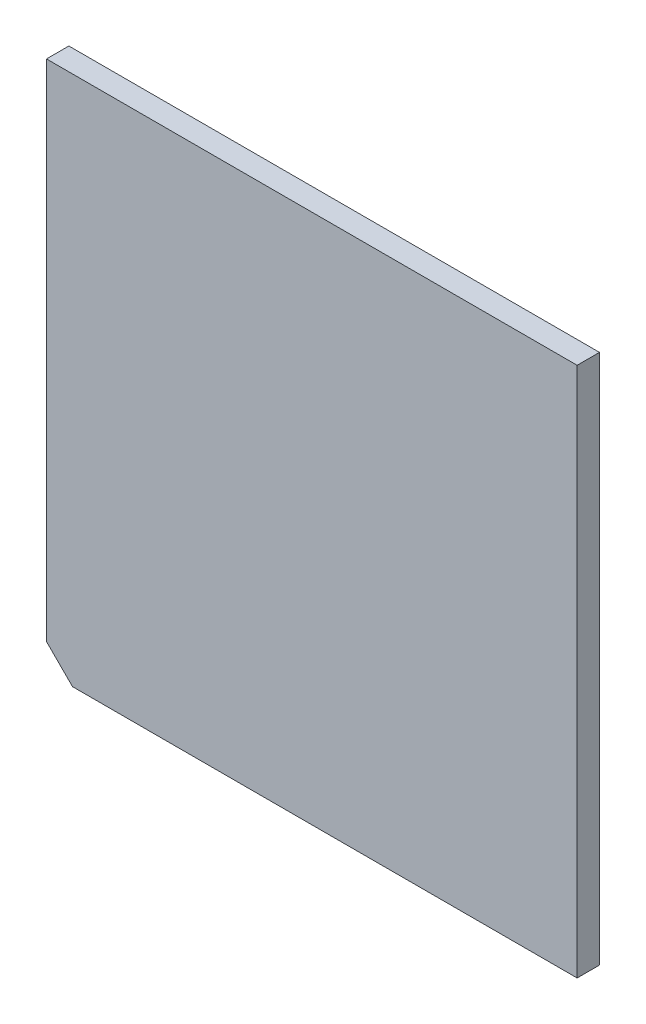
ISO-10303-21;
HEADER;
FILE_DESCRIPTION(('STEP AP214'),'2;1');
FILE_NAME('part.step','',(''),(''),'','','');
FILE_SCHEMA(('AUTOMOTIVE_DESIGN { 1 0 10303 214 1 1 1 1 }'));
ENDSEC;
DATA;
#1=APPLICATION_CONTEXT('core data for automotive mechanical design processes');
#2=APPLICATION_PROTOCOL_DEFINITION('international standard','automotive_design',2000,#1);
#3=PRODUCT_CONTEXT('',#1,'mechanical');
#4=PRODUCT('Part','Part','',(#3));
#5=PRODUCT_RELATED_PRODUCT_CATEGORY('part','',(#4));
#6=PRODUCT_DEFINITION_FORMATION('','',#4);
#7=PRODUCT_DEFINITION_CONTEXT('part definition',#1,'design');
#8=PRODUCT_DEFINITION('design','',#6,#7);
#9=PRODUCT_DEFINITION_SHAPE('','',#8);
#10=(LENGTH_UNIT() NAMED_UNIT(*) SI_UNIT(.MILLI.,.METRE.));
#11=(NAMED_UNIT(*) PLANE_ANGLE_UNIT() SI_UNIT($,.RADIAN.));
#12=(NAMED_UNIT(*) SI_UNIT($,.STERADIAN.) SOLID_ANGLE_UNIT());
#13=UNCERTAINTY_MEASURE_WITH_UNIT(LENGTH_MEASURE(1.E-05),#10,'distance_accuracy_value','');
#14=(GEOMETRIC_REPRESENTATION_CONTEXT(3) GLOBAL_UNCERTAINTY_ASSIGNED_CONTEXT((#13)) GLOBAL_UNIT_ASSIGNED_CONTEXT((#10,
#11,#12)) REPRESENTATION_CONTEXT('',''));
#15=CARTESIAN_POINT('',(0.,0.,0.));
#16=DIRECTION('',(0.,0.,1.));
#17=DIRECTION('',(1.,0.,0.));
#18=AXIS2_PLACEMENT_3D('',#15,#16,#17);
#19=CARTESIAN_POINT('',(51.,51.,4.3));
#20=DIRECTION('',(-1.,0.,0.));
#21=DIRECTION('',(0.,-1.,0.));
#22=AXIS2_PLACEMENT_3D('',#19,#20,#21);
#23=PLANE('',#22);
#24=DIRECTION('',(0.,1.,0.));
#25=VECTOR('',#24,1.);
#26=CARTESIAN_POINT('',(51.,51.,0.));
#27=LINE('',#26,#25);
#28=CARTESIAN_POINT('',(51.,-51.,0.));
#29=VERTEX_POINT('',#28);
#30=CARTESIAN_POINT('',(51.,51.,0.));
#31=VERTEX_POINT('',#30);
#32=EDGE_CURVE('E115',#29,#31,#27,.T.);
#33=ORIENTED_EDGE('',*,*,#32,.T.);
#34=DIRECTION('',(0.,0.,-1.));
#35=VECTOR('',#34,1.);
#36=CARTESIAN_POINT('',(51.,51.,4.3));
#37=LINE('',#36,#35);
#38=CARTESIAN_POINT('',(51.,51.,4.3));
#39=VERTEX_POINT('',#38);
#40=EDGE_CURVE('E95',#39,#31,#37,.T.);
#41=ORIENTED_EDGE('',*,*,#40,.F.);
#42=DIRECTION('',(0.,1.,0.));
#43=VECTOR('',#42,1.);
#44=CARTESIAN_POINT('',(51.,51.,4.3));
#45=LINE('',#44,#43);
#46=CARTESIAN_POINT('',(51.,-51.,4.3));
#47=VERTEX_POINT('',#46);
#48=EDGE_CURVE('E102',#47,#39,#45,.T.);
#49=ORIENTED_EDGE('',*,*,#48,.F.);
#50=DIRECTION('',(0.,0.,-1.));
#51=VECTOR('',#50,1.);
#52=CARTESIAN_POINT('',(51.,-51.,4.3));
#53=LINE('',#52,#51);
#54=EDGE_CURVE('E123',#47,#29,#53,.T.);
#55=ORIENTED_EDGE('',*,*,#54,.T.);
#56=EDGE_LOOP('',(#33,#41,#49,#55));
#57=FACE_BOUND('',#56,.T.);
#58=ADVANCED_FACE('F42',(#57),#23,.F.);
#59=CARTESIAN_POINT('',(-51.,51.,4.3));
#60=DIRECTION('',(0.,-1.,0.));
#61=DIRECTION('',(0.,0.,-1.));
#62=AXIS2_PLACEMENT_3D('',#59,#60,#61);
#63=PLANE('',#62);
#64=DIRECTION('',(-1.,0.,0.));
#65=VECTOR('',#64,1.);
#66=CARTESIAN_POINT('',(-51.,51.,0.));
#67=LINE('',#66,#65);
#68=CARTESIAN_POINT('',(-51.,51.,0.));
#69=VERTEX_POINT('',#68);
#70=EDGE_CURVE('E136',#31,#69,#67,.T.);
#71=ORIENTED_EDGE('',*,*,#70,.T.);
#72=DIRECTION('',(0.,0.,-1.));
#73=VECTOR('',#72,1.);
#74=CARTESIAN_POINT('',(-51.,51.,4.3));
#75=LINE('',#74,#73);
#76=CARTESIAN_POINT('',(-51.,51.,4.3));
#77=VERTEX_POINT('',#76);
#78=EDGE_CURVE('E98',#77,#69,#75,.T.);
#79=ORIENTED_EDGE('',*,*,#78,.F.);
#80=DIRECTION('',(-1.,0.,0.));
#81=VECTOR('',#80,1.);
#82=CARTESIAN_POINT('',(-51.,51.,4.3));
#83=LINE('',#82,#81);
#84=EDGE_CURVE('E91',#39,#77,#83,.T.);
#85=ORIENTED_EDGE('',*,*,#84,.F.);
#86=ORIENTED_EDGE('',*,*,#40,.T.);
#87=EDGE_LOOP('',(#71,#79,#85,#86));
#88=FACE_BOUND('',#87,.T.);
#89=ADVANCED_FACE('F93',(#88),#63,.F.);
#90=CARTESIAN_POINT('',(-51.,51.,4.3));
#91=DIRECTION('',(1.,0.,0.));
#92=DIRECTION('',(0.,1.,0.));
#93=AXIS2_PLACEMENT_3D('',#90,#91,#92);
#94=PLANE('',#93);
#95=DIRECTION('',(0.,-1.,0.));
#96=VECTOR('',#95,1.);
#97=CARTESIAN_POINT('',(-51.,51.,0.));
#98=LINE('',#97,#96);
#99=CARTESIAN_POINT('',(-51.,-45.9999999999999,0.));
#100=VERTEX_POINT('',#99);
#101=EDGE_CURVE('E133',#69,#100,#98,.T.);
#102=ORIENTED_EDGE('',*,*,#101,.T.);
#103=DIRECTION('',(0.,0.,1.));
#104=VECTOR('',#103,1.);
#105=CARTESIAN_POINT('',(-51.,-45.9999999999999,4.3));
#106=LINE('',#105,#104);
#107=CARTESIAN_POINT('',(-51.,-45.9999999999999,4.3));
#108=VERTEX_POINT('',#107);
#109=EDGE_CURVE('E52',#100,#108,#106,.T.);
#110=ORIENTED_EDGE('',*,*,#109,.T.);
#111=DIRECTION('',(0.,-1.,0.));
#112=VECTOR('',#111,1.);
#113=CARTESIAN_POINT('',(-51.,51.,4.3));
#114=LINE('',#113,#112);
#115=EDGE_CURVE('E101',#77,#108,#114,.T.);
#116=ORIENTED_EDGE('',*,*,#115,.F.);
#117=ORIENTED_EDGE('',*,*,#78,.T.);
#118=EDGE_LOOP('',(#102,#110,#116,#117));
#119=FACE_BOUND('',#118,.T.);
#120=ADVANCED_FACE('F150',(#119),#94,.F.);
#121=CARTESIAN_POINT('',(-51.,-51.,4.3));
#122=DIRECTION('',(0.,1.,0.));
#123=DIRECTION('',(0.,0.,1.));
#124=AXIS2_PLACEMENT_3D('',#121,#122,#123);
#125=PLANE('',#124);
#126=DIRECTION('',(1.,0.,0.));
#127=VECTOR('',#126,1.);
#128=CARTESIAN_POINT('',(-51.,-51.,4.3));
#129=LINE('',#128,#127);
#130=CARTESIAN_POINT('',(-45.9999999999999,-51.,4.3));
#131=VERTEX_POINT('',#130);
#132=EDGE_CURVE('E107',#131,#47,#129,.T.);
#133=ORIENTED_EDGE('',*,*,#132,.F.);
#134=DIRECTION('',(0.,0.,-1.));
#135=VECTOR('',#134,1.);
#136=CARTESIAN_POINT('',(-45.9999999999999,-51.,4.3));
#137=LINE('',#136,#135);
#138=CARTESIAN_POINT('',(-45.9999999999999,-51.,0.));
#139=VERTEX_POINT('',#138);
#140=EDGE_CURVE('E117',#131,#139,#137,.T.);
#141=ORIENTED_EDGE('',*,*,#140,.T.);
#142=DIRECTION('',(1.,0.,0.));
#143=VECTOR('',#142,1.);
#144=CARTESIAN_POINT('',(-51.,-51.,0.));
#145=LINE('',#144,#143);
#146=EDGE_CURVE('E112',#139,#29,#145,.T.);
#147=ORIENTED_EDGE('',*,*,#146,.T.);
#148=ORIENTED_EDGE('',*,*,#54,.F.);
#149=EDGE_LOOP('',(#133,#141,#147,#148));
#150=FACE_BOUND('',#149,.T.);
#151=ADVANCED_FACE('F148',(#150),#125,.F.);
#152=CARTESIAN_POINT('',(0.,0.,4.3));
#153=DIRECTION('',(0.,0.,1.));
#154=DIRECTION('',(1.,0.,0.));
#155=AXIS2_PLACEMENT_3D('',#152,#153,#154);
#156=PLANE('',#155);
#157=ORIENTED_EDGE('',*,*,#115,.T.);
#158=DIRECTION('',(-0.707106781186548,0.707106781186548,0.));
#159=VECTOR('',#158,1.);
#160=CARTESIAN_POINT('',(-48.5,-48.5,4.3));
#161=LINE('',#160,#159);
#162=EDGE_CURVE('E11',#108,#131,#161,.F.);
#163=ORIENTED_EDGE('',*,*,#162,.T.);
#164=ORIENTED_EDGE('',*,*,#132,.T.);
#165=ORIENTED_EDGE('',*,*,#48,.T.);
#166=ORIENTED_EDGE('',*,*,#84,.T.);
#167=EDGE_LOOP('',(#157,#163,#164,#165,#166));
#168=FACE_BOUND('',#167,.T.);
#169=ADVANCED_FACE('F105',(#168),#156,.T.);
#170=CARTESIAN_POINT('',(0.,0.,0.));
#171=DIRECTION('',(0.,0.,1.));
#172=DIRECTION('',(1.,0.,0.));
#173=AXIS2_PLACEMENT_3D('',#170,#171,#172);
#174=PLANE('',#173);
#175=ORIENTED_EDGE('',*,*,#146,.F.);
#176=DIRECTION('',(0.707106781186548,-0.707106781186548,0.));
#177=VECTOR('',#176,1.);
#178=CARTESIAN_POINT('',(-45.9999999999999,-51.,0.));
#179=LINE('',#178,#177);
#180=EDGE_CURVE('E66',#139,#100,#179,.F.);
#181=ORIENTED_EDGE('',*,*,#180,.T.);
#182=ORIENTED_EDGE('',*,*,#101,.F.);
#183=ORIENTED_EDGE('',*,*,#70,.F.);
#184=ORIENTED_EDGE('',*,*,#32,.F.);
#185=EDGE_LOOP('',(#175,#181,#182,#183,#184));
#186=FACE_BOUND('',#185,.T.);
#187=ADVANCED_FACE('F149',(#186),#174,.F.);
#188=CARTESIAN_POINT('',(-45.9999999999999,-51.,4.3));
#189=DIRECTION('',(0.707106781186548,0.707106781186548,0.));
#190=DIRECTION('',(0.,0.,-1.));
#191=AXIS2_PLACEMENT_3D('',#188,#189,#190);
#192=PLANE('',#191);
#193=ORIENTED_EDGE('',*,*,#162,.F.);
#194=ORIENTED_EDGE('',*,*,#109,.F.);
#195=ORIENTED_EDGE('',*,*,#180,.F.);
#196=ORIENTED_EDGE('',*,*,#140,.F.);
#197=EDGE_LOOP('',(#193,#194,#195,#196));
#198=FACE_BOUND('',#197,.T.);
#199=ADVANCED_FACE('F45',(#198),#192,.F.);
#200=CLOSED_SHELL('',(#58,#89,#120,#151,#169,#187,#199));
#201=MANIFOLD_SOLID_BREP('B2',#200);
#202=ADVANCED_BREP_SHAPE_REPRESENTATION('',(#18,#201),#14);
#203=SHAPE_DEFINITION_REPRESENTATION(#9,#202);
ENDSEC;
END-ISO-10303-21;
